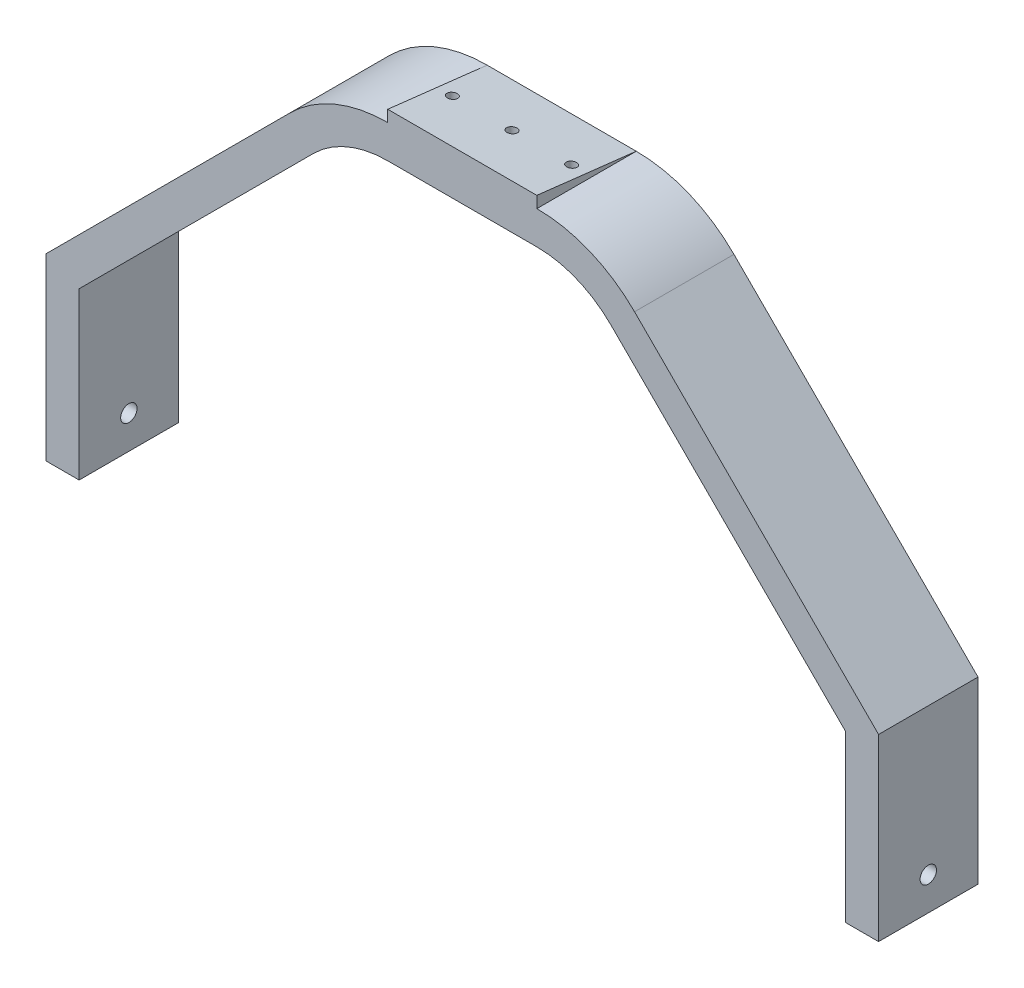
ISO-10303-21;
HEADER;
FILE_DESCRIPTION(('STEP AP214'),'2;1');
FILE_NAME('part.step','',(''),(''),'','','');
FILE_SCHEMA(('AUTOMOTIVE_DESIGN { 1 0 10303 214 1 1 1 1 }'));
ENDSEC;
DATA;
#1=APPLICATION_CONTEXT('core data for automotive mechanical design processes');
#2=APPLICATION_PROTOCOL_DEFINITION('international standard','automotive_design',2000,#1);
#3=PRODUCT_CONTEXT('',#1,'mechanical');
#4=PRODUCT('Part','Part','',(#3));
#5=PRODUCT_RELATED_PRODUCT_CATEGORY('part','',(#4));
#6=PRODUCT_DEFINITION_FORMATION('','',#4);
#7=PRODUCT_DEFINITION_CONTEXT('part definition',#1,'design');
#8=PRODUCT_DEFINITION('design','',#6,#7);
#9=PRODUCT_DEFINITION_SHAPE('','',#8);
#10=(LENGTH_UNIT() NAMED_UNIT(*) SI_UNIT(.MILLI.,.METRE.));
#11=(NAMED_UNIT(*) PLANE_ANGLE_UNIT() SI_UNIT($,.RADIAN.));
#12=(NAMED_UNIT(*) SI_UNIT($,.STERADIAN.) SOLID_ANGLE_UNIT());
#13=UNCERTAINTY_MEASURE_WITH_UNIT(LENGTH_MEASURE(1.E-05),#10,'distance_accuracy_value','');
#14=(GEOMETRIC_REPRESENTATION_CONTEXT(3) GLOBAL_UNCERTAINTY_ASSIGNED_CONTEXT((#13)) GLOBAL_UNIT_ASSIGNED_CONTEXT((#10,
#11,#12)) REPRESENTATION_CONTEXT('',''));
#15=CARTESIAN_POINT('',(0.,0.,0.));
#16=DIRECTION('',(0.,0.,1.));
#17=DIRECTION('',(1.,0.,0.));
#18=AXIS2_PLACEMENT_3D('',#15,#16,#17);
#19=CARTESIAN_POINT('',(22.5,-36.689440670309,30.));
#20=DIRECTION('',(0.,0.,-1.));
#21=DIRECTION('',(-1.,0.,0.));
#22=AXIS2_PLACEMENT_3D('',#19,#20,#21);
#23=CYLINDRICAL_SURFACE('',#22,41.689440670309);
#24=CARTESIAN_POINT('',(22.5,-36.689440670309,0.));
#25=DIRECTION('',(0.,0.,1.));
#26=DIRECTION('',(-1.,0.,0.));
#27=AXIS2_PLACEMENT_3D('',#24,#25,#26);
#28=CIRCLE('',#27,41.689440670309);
#29=CARTESIAN_POINT('',(51.9788862018499,-7.21055446845947,0.));
#30=VERTEX_POINT('',#29);
#31=CARTESIAN_POINT('',(22.5,5.,0.));
#32=VERTEX_POINT('',#31);
#33=EDGE_CURVE('E201',#30,#32,#28,.T.);
#34=ORIENTED_EDGE('',*,*,#33,.T.);
#35=DIRECTION('',(0.,0.,-1.));
#36=VECTOR('',#35,1.);
#37=CARTESIAN_POINT('',(22.5,5.,30.));
#38=LINE('',#37,#36);
#39=CARTESIAN_POINT('',(22.5,5.,30.));
#40=VERTEX_POINT('',#39);
#41=EDGE_CURVE('E11',#40,#32,#38,.T.);
#42=ORIENTED_EDGE('',*,*,#41,.F.);
#43=CARTESIAN_POINT('',(22.5,-36.689440670309,30.));
#44=DIRECTION('',(0.,0.,1.));
#45=DIRECTION('',(-1.,0.,0.));
#46=AXIS2_PLACEMENT_3D('',#43,#44,#45);
#47=CIRCLE('',#46,41.689440670309);
#48=CARTESIAN_POINT('',(51.9788862018499,-7.21055446845947,30.));
#49=VERTEX_POINT('',#48);
#50=EDGE_CURVE('E247',#49,#40,#47,.T.);
#51=ORIENTED_EDGE('',*,*,#50,.F.);
#52=DIRECTION('',(0.,0.,-1.));
#53=VECTOR('',#52,1.);
#54=CARTESIAN_POINT('',(51.9788862018499,-7.21055446845947,30.));
#55=LINE('',#54,#53);
#56=EDGE_CURVE('E197',#49,#30,#55,.T.);
#57=ORIENTED_EDGE('',*,*,#56,.T.);
#58=EDGE_LOOP('',(#34,#42,#51,#57));
#59=FACE_BOUND('',#58,.T.);
#60=ADVANCED_FACE('F45',(#59),#23,.T.);
#61=CARTESIAN_POINT('',(-22.5,-36.689440670309,30.));
#62=DIRECTION('',(0.,0.,-1.));
#63=DIRECTION('',(-1.,0.,0.));
#64=AXIS2_PLACEMENT_3D('',#61,#62,#63);
#65=CYLINDRICAL_SURFACE('',#64,41.689440670309);
#66=CARTESIAN_POINT('',(-22.5,-36.689440670309,0.));
#67=DIRECTION('',(0.,0.,1.));
#68=DIRECTION('',(1.,0.,0.));
#69=AXIS2_PLACEMENT_3D('',#66,#67,#68);
#70=CIRCLE('',#69,41.689440670309);
#71=CARTESIAN_POINT('',(-22.5,5.,0.));
#72=VERTEX_POINT('',#71);
#73=CARTESIAN_POINT('',(-51.9788862018499,-7.21055446845943,0.));
#74=VERTEX_POINT('',#73);
#75=EDGE_CURVE('E205',#72,#74,#70,.T.);
#76=ORIENTED_EDGE('',*,*,#75,.T.);
#77=DIRECTION('',(0.,0.,-1.));
#78=VECTOR('',#77,1.);
#79=CARTESIAN_POINT('',(-51.9788862018499,-7.21055446845943,30.));
#80=LINE('',#79,#78);
#81=CARTESIAN_POINT('',(-51.9788862018499,-7.21055446845943,30.));
#82=VERTEX_POINT('',#81);
#83=EDGE_CURVE('E290',#82,#74,#80,.T.);
#84=ORIENTED_EDGE('',*,*,#83,.F.);
#85=CARTESIAN_POINT('',(-22.5,-36.689440670309,30.));
#86=DIRECTION('',(0.,0.,1.));
#87=DIRECTION('',(1.,0.,0.));
#88=AXIS2_PLACEMENT_3D('',#85,#86,#87);
#89=CIRCLE('',#88,41.689440670309);
#90=CARTESIAN_POINT('',(-22.5,5.,30.));
#91=VERTEX_POINT('',#90);
#92=EDGE_CURVE('E359',#91,#82,#89,.T.);
#93=ORIENTED_EDGE('',*,*,#92,.F.);
#94=DIRECTION('',(0.,0.,-1.));
#95=VECTOR('',#94,1.);
#96=CARTESIAN_POINT('',(-22.5,5.,30.));
#97=LINE('',#96,#95);
#98=EDGE_CURVE('E54',#91,#72,#97,.T.);
#99=ORIENTED_EDGE('',*,*,#98,.T.);
#100=EDGE_LOOP('',(#76,#84,#93,#99));
#101=FACE_BOUND('',#100,.T.);
#102=ADVANCED_FACE('F414',(#101),#65,.T.);
#103=CARTESIAN_POINT('',(-122.689564320504,-77.9212325871146,30.));
#104=DIRECTION('',(0.707106781186551,-0.707106781186544,0.));
#105=DIRECTION('',(0.707106781186544,0.707106781186551,0.));
#106=AXIS2_PLACEMENT_3D('',#103,#104,#105);
#107=PLANE('',#106);
#108=DIRECTION('',(-0.707106781186544,-0.707106781186551,0.));
#109=VECTOR('',#108,1.);
#110=CARTESIAN_POINT('',(-122.689564320504,-77.9212325871146,0.));
#111=LINE('',#110,#109);
#112=CARTESIAN_POINT('',(-125.618496508639,-80.8501647752491,0.));
#113=VERTEX_POINT('',#112);
#114=EDGE_CURVE('E210',#74,#113,#111,.T.);
#115=ORIENTED_EDGE('',*,*,#114,.T.);
#116=DIRECTION('',(0.,0.,-1.));
#117=VECTOR('',#116,1.);
#118=CARTESIAN_POINT('',(-125.618496508639,-80.8501647752491,30.));
#119=LINE('',#118,#117);
#120=CARTESIAN_POINT('',(-125.618496508639,-80.8501647752491,30.));
#121=VERTEX_POINT('',#120);
#122=EDGE_CURVE('E286',#121,#113,#119,.T.);
#123=ORIENTED_EDGE('',*,*,#122,.F.);
#124=DIRECTION('',(-0.707106781186544,-0.707106781186551,0.));
#125=VECTOR('',#124,1.);
#126=CARTESIAN_POINT('',(-51.9788862018499,-7.21055446845943,30.));
#127=LINE('',#126,#125);
#128=EDGE_CURVE('E362',#82,#121,#127,.T.);
#129=ORIENTED_EDGE('',*,*,#128,.F.);
#130=ORIENTED_EDGE('',*,*,#83,.T.);
#131=EDGE_LOOP('',(#115,#123,#129,#130));
#132=FACE_BOUND('',#131,.T.);
#133=ADVANCED_FACE('F434',(#132),#107,.F.);
#134=CARTESIAN_POINT('',(-125.618496508639,-134.99230039898,30.));
#135=DIRECTION('',(1.,0.,0.));
#136=DIRECTION('',(0.,0.,-1.));
#137=AXIS2_PLACEMENT_3D('',#134,#135,#136);
#138=PLANE('',#137);
#139=CARTESIAN_POINT('',(-125.618496508639,-124.99230039898,15.));
#140=DIRECTION('',(-1.,0.,0.));
#141=DIRECTION('',(0.,0.,1.));
#142=AXIS2_PLACEMENT_3D('',#139,#140,#141);
#143=CIRCLE('',#142,2.475);
#144=CARTESIAN_POINT('',(-125.618496508639,-124.99230039898,17.475));
#145=VERTEX_POINT('',#144);
#146=EDGE_CURVE('E310',#145,#145,#143,.T.);
#147=ORIENTED_EDGE('',*,*,#146,.F.);
#148=EDGE_LOOP('',(#147));
#149=FACE_BOUND('',#148,.T.);
#150=DIRECTION('',(0.,-1.,0.));
#151=VECTOR('',#150,1.);
#152=CARTESIAN_POINT('',(-125.618496508639,-134.99230039898,0.));
#153=LINE('',#152,#151);
#154=CARTESIAN_POINT('',(-125.618496508639,-134.99230039898,0.));
#155=VERTEX_POINT('',#154);
#156=EDGE_CURVE('E213',#113,#155,#153,.T.);
#157=ORIENTED_EDGE('',*,*,#156,.T.);
#158=DIRECTION('',(0.,0.,-1.));
#159=VECTOR('',#158,1.);
#160=CARTESIAN_POINT('',(-125.618496508639,-134.99230039898,30.));
#161=LINE('',#160,#159);
#162=CARTESIAN_POINT('',(-125.618496508639,-134.99230039898,30.));
#163=VERTEX_POINT('',#162);
#164=EDGE_CURVE('E282',#163,#155,#161,.T.);
#165=ORIENTED_EDGE('',*,*,#164,.F.);
#166=DIRECTION('',(0.,-1.,0.));
#167=VECTOR('',#166,1.);
#168=CARTESIAN_POINT('',(-125.618496508639,-134.99230039898,30.));
#169=LINE('',#168,#167);
#170=EDGE_CURVE('E365',#121,#163,#169,.T.);
#171=ORIENTED_EDGE('',*,*,#170,.F.);
#172=ORIENTED_EDGE('',*,*,#122,.T.);
#173=EDGE_LOOP('',(#157,#165,#171,#172));
#174=FACE_BOUND('',#173,.T.);
#175=ADVANCED_FACE('F439',(#149,#174),#138,.F.);
#176=CARTESIAN_POINT('',(-115.618496508639,-134.99230039898,30.));
#177=DIRECTION('',(0.,1.,0.));
#178=DIRECTION('',(0.,0.,1.));
#179=AXIS2_PLACEMENT_3D('',#176,#177,#178);
#180=PLANE('',#179);
#181=DIRECTION('',(1.,0.,0.));
#182=VECTOR('',#181,1.);
#183=CARTESIAN_POINT('',(-115.618496508639,-134.99230039898,0.));
#184=LINE('',#183,#182);
#185=CARTESIAN_POINT('',(-115.618496508639,-134.99230039898,0.));
#186=VERTEX_POINT('',#185);
#187=EDGE_CURVE('E216',#155,#186,#184,.T.);
#188=ORIENTED_EDGE('',*,*,#187,.T.);
#189=DIRECTION('',(0.,0.,-1.));
#190=VECTOR('',#189,1.);
#191=CARTESIAN_POINT('',(-115.618496508639,-134.99230039898,30.));
#192=LINE('',#191,#190);
#193=CARTESIAN_POINT('',(-115.618496508639,-134.99230039898,30.));
#194=VERTEX_POINT('',#193);
#195=EDGE_CURVE('E278',#194,#186,#192,.T.);
#196=ORIENTED_EDGE('',*,*,#195,.F.);
#197=DIRECTION('',(1.,0.,0.));
#198=VECTOR('',#197,1.);
#199=CARTESIAN_POINT('',(-115.618496508639,-134.99230039898,30.));
#200=LINE('',#199,#198);
#201=EDGE_CURVE('E368',#163,#194,#200,.T.);
#202=ORIENTED_EDGE('',*,*,#201,.F.);
#203=ORIENTED_EDGE('',*,*,#164,.T.);
#204=EDGE_LOOP('',(#188,#196,#202,#203));
#205=FACE_BOUND('',#204,.T.);
#206=ADVANCED_FACE('F445',(#205),#180,.F.);
#207=CARTESIAN_POINT('',(-115.618496508639,-84.99230039898,30.));
#208=DIRECTION('',(-1.,0.,0.));
#209=DIRECTION('',(0.,0.,1.));
#210=AXIS2_PLACEMENT_3D('',#207,#208,#209);
#211=PLANE('',#210);
#212=CARTESIAN_POINT('',(-115.618496508639,-124.99230039898,15.));
#213=DIRECTION('',(-1.,0.,0.));
#214=DIRECTION('',(0.,0.,1.));
#215=AXIS2_PLACEMENT_3D('',#212,#213,#214);
#216=CIRCLE('',#215,2.475);
#217=CARTESIAN_POINT('',(-115.618496508639,-124.99230039898,17.475));
#218=VERTEX_POINT('',#217);
#219=EDGE_CURVE('E206',#218,#218,#216,.T.);
#220=ORIENTED_EDGE('',*,*,#219,.T.);
#221=EDGE_LOOP('',(#220));
#222=FACE_BOUND('',#221,.T.);
#223=DIRECTION('',(0.,1.,0.));
#224=VECTOR('',#223,1.);
#225=CARTESIAN_POINT('',(-115.618496508639,-84.99230039898,0.));
#226=LINE('',#225,#224);
#227=CARTESIAN_POINT('',(-115.618496508639,-84.99230039898,0.));
#228=VERTEX_POINT('',#227);
#229=EDGE_CURVE('E219',#186,#228,#226,.T.);
#230=ORIENTED_EDGE('',*,*,#229,.T.);
#231=DIRECTION('',(0.,0.,-1.));
#232=VECTOR('',#231,1.);
#233=CARTESIAN_POINT('',(-115.618496508639,-84.99230039898,30.));
#234=LINE('',#233,#232);
#235=CARTESIAN_POINT('',(-115.618496508639,-84.99230039898,30.));
#236=VERTEX_POINT('',#235);
#237=EDGE_CURVE('E274',#236,#228,#234,.T.);
#238=ORIENTED_EDGE('',*,*,#237,.F.);
#239=DIRECTION('',(0.,1.,0.));
#240=VECTOR('',#239,1.);
#241=CARTESIAN_POINT('',(-115.618496508639,-84.99230039898,30.));
#242=LINE('',#241,#240);
#243=EDGE_CURVE('E371',#194,#236,#242,.T.);
#244=ORIENTED_EDGE('',*,*,#243,.F.);
#245=ORIENTED_EDGE('',*,*,#195,.T.);
#246=EDGE_LOOP('',(#230,#238,#244,#245));
#247=FACE_BOUND('',#246,.T.);
#248=ADVANCED_FACE('F449',(#222,#247),#211,.F.);
#249=CARTESIAN_POINT('',(-44.9078183899844,-14.2816222803249,30.));
#250=DIRECTION('',(-0.707106781186551,0.707106781186544,0.));
#251=DIRECTION('',(-0.707106781186544,-0.707106781186551,0.));
#252=AXIS2_PLACEMENT_3D('',#249,#250,#251);
#253=PLANE('',#252);
#254=DIRECTION('',(0.707106781186544,0.707106781186551,0.));
#255=VECTOR('',#254,1.);
#256=CARTESIAN_POINT('',(-44.9078183899844,-14.2816222803249,0.));
#257=LINE('',#256,#255);
#258=CARTESIAN_POINT('',(-44.9078183899844,-14.2816222803249,0.));
#259=VERTEX_POINT('',#258);
#260=EDGE_CURVE('E222',#228,#259,#257,.T.);
#261=ORIENTED_EDGE('',*,*,#260,.T.);
#262=DIRECTION('',(0.,0.,-1.));
#263=VECTOR('',#262,1.);
#264=CARTESIAN_POINT('',(-44.9078183899844,-14.2816222803249,30.));
#265=LINE('',#264,#263);
#266=CARTESIAN_POINT('',(-44.9078183899844,-14.2816222803249,30.));
#267=VERTEX_POINT('',#266);
#268=EDGE_CURVE('E270',#267,#259,#265,.T.);
#269=ORIENTED_EDGE('',*,*,#268,.F.);
#270=DIRECTION('',(0.707106781186544,0.707106781186551,0.));
#271=VECTOR('',#270,1.);
#272=CARTESIAN_POINT('',(-44.9078183899844,-14.2816222803249,30.));
#273=LINE('',#272,#271);
#274=EDGE_CURVE('E374',#236,#267,#273,.T.);
#275=ORIENTED_EDGE('',*,*,#274,.F.);
#276=ORIENTED_EDGE('',*,*,#237,.T.);
#277=EDGE_LOOP('',(#261,#269,#275,#276));
#278=FACE_BOUND('',#277,.T.);
#279=ADVANCED_FACE('F453',(#278),#253,.F.);
#280=CARTESIAN_POINT('',(-22.5,-36.689440670309,30.));
#281=DIRECTION('',(0.,0.,-1.));
#282=DIRECTION('',(-1.,0.,0.));
#283=AXIS2_PLACEMENT_3D('',#280,#281,#282);
#284=CYLINDRICAL_SURFACE('',#283,31.689440670309);
#285=CARTESIAN_POINT('',(-22.5,-36.689440670309,0.));
#286=DIRECTION('',(0.,0.,-1.));
#287=DIRECTION('',(1.,0.,0.));
#288=AXIS2_PLACEMENT_3D('',#285,#286,#287);
#289=CIRCLE('',#288,31.689440670309);
#290=CARTESIAN_POINT('',(-22.5,-5.,0.));
#291=VERTEX_POINT('',#290);
#292=EDGE_CURVE('E225',#259,#291,#289,.T.);
#293=ORIENTED_EDGE('',*,*,#292,.T.);
#294=DIRECTION('',(0.,0.,-1.));
#295=VECTOR('',#294,1.);
#296=CARTESIAN_POINT('',(-22.5,-5.,30.));
#297=LINE('',#296,#295);
#298=CARTESIAN_POINT('',(-22.5,-5.,30.));
#299=VERTEX_POINT('',#298);
#300=EDGE_CURVE('E266',#299,#291,#297,.T.);
#301=ORIENTED_EDGE('',*,*,#300,.F.);
#302=CARTESIAN_POINT('',(-22.5,-36.689440670309,30.));
#303=DIRECTION('',(0.,0.,-1.));
#304=DIRECTION('',(1.,0.,0.));
#305=AXIS2_PLACEMENT_3D('',#302,#303,#304);
#306=CIRCLE('',#305,31.689440670309);
#307=EDGE_CURVE('E377',#267,#299,#306,.T.);
#308=ORIENTED_EDGE('',*,*,#307,.F.);
#309=ORIENTED_EDGE('',*,*,#268,.T.);
#310=EDGE_LOOP('',(#293,#301,#308,#309));
#311=FACE_BOUND('',#310,.T.);
#312=ADVANCED_FACE('F457',(#311),#284,.F.);
#313=CARTESIAN_POINT('',(-22.5,-5.,30.));
#314=DIRECTION('',(0.,1.,0.));
#315=DIRECTION('',(0.,0.,1.));
#316=AXIS2_PLACEMENT_3D('',#313,#314,#315);
#317=PLANE('',#316);
#318=CARTESIAN_POINT('',(18.,-5.,15.));
#319=DIRECTION('',(0.,1.,0.));
#320=DIRECTION('',(0.,0.,1.));
#321=AXIS2_PLACEMENT_3D('',#318,#319,#320);
#322=CIRCLE('',#321,1.5);
#323=CARTESIAN_POINT('',(18.,-5.,16.5));
#324=VERTEX_POINT('',#323);
#325=EDGE_CURVE('E306',#324,#324,#322,.T.);
#326=ORIENTED_EDGE('',*,*,#325,.T.);
#327=EDGE_LOOP('',(#326));
#328=FACE_BOUND('',#327,.T.);
#329=CARTESIAN_POINT('',(-18.,-5.,15.));
#330=DIRECTION('',(0.,1.,0.));
#331=DIRECTION('',(0.,0.,1.));
#332=AXIS2_PLACEMENT_3D('',#329,#330,#331);
#333=CIRCLE('',#332,1.5);
#334=CARTESIAN_POINT('',(-18.,-5.,16.5));
#335=VERTEX_POINT('',#334);
#336=EDGE_CURVE('E301',#335,#335,#333,.T.);
#337=ORIENTED_EDGE('',*,*,#336,.T.);
#338=EDGE_LOOP('',(#337));
#339=FACE_BOUND('',#338,.T.);
#340=CARTESIAN_POINT('',(0.,-5.,15.));
#341=DIRECTION('',(0.,1.,0.));
#342=DIRECTION('',(0.,0.,1.));
#343=AXIS2_PLACEMENT_3D('',#340,#341,#342);
#344=CIRCLE('',#343,1.5);
#345=CARTESIAN_POINT('',(0.,-5.,16.5));
#346=VERTEX_POINT('',#345);
#347=EDGE_CURVE('E297',#346,#346,#344,.T.);
#348=ORIENTED_EDGE('',*,*,#347,.T.);
#349=EDGE_LOOP('',(#348));
#350=FACE_BOUND('',#349,.T.);
#351=DIRECTION('',(1.,0.,0.));
#352=VECTOR('',#351,1.);
#353=CARTESIAN_POINT('',(-22.5,-5.,0.));
#354=LINE('',#353,#352);
#355=CARTESIAN_POINT('',(22.5,-5.,0.));
#356=VERTEX_POINT('',#355);
#357=EDGE_CURVE('E228',#291,#356,#354,.T.);
#358=ORIENTED_EDGE('',*,*,#357,.T.);
#359=DIRECTION('',(0.,0.,-1.));
#360=VECTOR('',#359,1.);
#361=CARTESIAN_POINT('',(22.5,-5.,30.));
#362=LINE('',#361,#360);
#363=CARTESIAN_POINT('',(22.5,-5.,30.));
#364=VERTEX_POINT('',#363);
#365=EDGE_CURVE('E262',#364,#356,#362,.T.);
#366=ORIENTED_EDGE('',*,*,#365,.F.);
#367=DIRECTION('',(1.,0.,0.));
#368=VECTOR('',#367,1.);
#369=CARTESIAN_POINT('',(-22.5,-5.,30.));
#370=LINE('',#369,#368);
#371=EDGE_CURVE('E380',#299,#364,#370,.T.);
#372=ORIENTED_EDGE('',*,*,#371,.F.);
#373=ORIENTED_EDGE('',*,*,#300,.T.);
#374=EDGE_LOOP('',(#358,#366,#372,#373));
#375=FACE_BOUND('',#374,.T.);
#376=ADVANCED_FACE('F461',(#328,#339,#350,#375),#317,.F.);
#377=CARTESIAN_POINT('',(22.5,-36.689440670309,30.));
#378=DIRECTION('',(0.,0.,-1.));
#379=DIRECTION('',(-1.,0.,0.));
#380=AXIS2_PLACEMENT_3D('',#377,#378,#379);
#381=CYLINDRICAL_SURFACE('',#380,31.689440670309);
#382=CARTESIAN_POINT('',(22.5,-36.689440670309,0.));
#383=DIRECTION('',(0.,0.,-1.));
#384=DIRECTION('',(-1.,0.,0.));
#385=AXIS2_PLACEMENT_3D('',#382,#383,#384);
#386=CIRCLE('',#385,31.689440670309);
#387=CARTESIAN_POINT('',(44.9078183899844,-14.2816222803249,0.));
#388=VERTEX_POINT('',#387);
#389=EDGE_CURVE('E231',#356,#388,#386,.T.);
#390=ORIENTED_EDGE('',*,*,#389,.T.);
#391=DIRECTION('',(0.,0.,-1.));
#392=VECTOR('',#391,1.);
#393=CARTESIAN_POINT('',(44.9078183899844,-14.2816222803249,30.));
#394=LINE('',#393,#392);
#395=CARTESIAN_POINT('',(44.9078183899844,-14.2816222803249,30.));
#396=VERTEX_POINT('',#395);
#397=EDGE_CURVE('E258',#396,#388,#394,.T.);
#398=ORIENTED_EDGE('',*,*,#397,.F.);
#399=CARTESIAN_POINT('',(22.5,-36.689440670309,30.));
#400=DIRECTION('',(0.,0.,-1.));
#401=DIRECTION('',(-1.,0.,0.));
#402=AXIS2_PLACEMENT_3D('',#399,#400,#401);
#403=CIRCLE('',#402,31.689440670309);
#404=EDGE_CURVE('E383',#364,#396,#403,.T.);
#405=ORIENTED_EDGE('',*,*,#404,.F.);
#406=ORIENTED_EDGE('',*,*,#365,.T.);
#407=EDGE_LOOP('',(#390,#398,#405,#406));
#408=FACE_BOUND('',#407,.T.);
#409=ADVANCED_FACE('F464',(#408),#381,.F.);
#410=CARTESIAN_POINT('',(44.9078183899844,-14.2816222803249,30.));
#411=DIRECTION('',(0.707106781186552,0.707106781186543,0.));
#412=DIRECTION('',(-0.707106781186543,0.707106781186552,0.));
#413=AXIS2_PLACEMENT_3D('',#410,#411,#412);
#414=PLANE('',#413);
#415=DIRECTION('',(0.707106781186543,-0.707106781186552,0.));
#416=VECTOR('',#415,1.);
#417=CARTESIAN_POINT('',(44.9078183899844,-14.2816222803249,0.));
#418=LINE('',#417,#416);
#419=CARTESIAN_POINT('',(115.618496508639,-84.9923003989801,0.));
#420=VERTEX_POINT('',#419);
#421=EDGE_CURVE('E234',#388,#420,#418,.T.);
#422=ORIENTED_EDGE('',*,*,#421,.T.);
#423=DIRECTION('',(0.,0.,-1.));
#424=VECTOR('',#423,1.);
#425=CARTESIAN_POINT('',(115.618496508639,-84.9923003989801,30.));
#426=LINE('',#425,#424);
#427=CARTESIAN_POINT('',(115.618496508639,-84.9923003989801,30.));
#428=VERTEX_POINT('',#427);
#429=EDGE_CURVE('E254',#428,#420,#426,.T.);
#430=ORIENTED_EDGE('',*,*,#429,.F.);
#431=DIRECTION('',(0.707106781186543,-0.707106781186552,0.));
#432=VECTOR('',#431,1.);
#433=CARTESIAN_POINT('',(44.9078183899844,-14.2816222803249,30.));
#434=LINE('',#433,#432);
#435=EDGE_CURVE('E386',#396,#428,#434,.T.);
#436=ORIENTED_EDGE('',*,*,#435,.F.);
#437=ORIENTED_EDGE('',*,*,#397,.T.);
#438=EDGE_LOOP('',(#422,#430,#436,#437));
#439=FACE_BOUND('',#438,.T.);
#440=ADVANCED_FACE('F394',(#439),#414,.F.);
#441=CARTESIAN_POINT('',(115.618496508639,-84.9923003989801,30.));
#442=DIRECTION('',(1.,0.,0.));
#443=DIRECTION('',(0.,1.,0.));
#444=AXIS2_PLACEMENT_3D('',#441,#442,#443);
#445=PLANE('',#444);
#446=CARTESIAN_POINT('',(115.618496508639,-124.99230039898,15.));
#447=DIRECTION('',(1.,0.,0.));
#448=DIRECTION('',(0.,1.,0.));
#449=AXIS2_PLACEMENT_3D('',#446,#447,#448);
#450=CIRCLE('',#449,2.475);
#451=CARTESIAN_POINT('',(115.618496508639,-122.51730039898,15.));
#452=VERTEX_POINT('',#451);
#453=EDGE_CURVE('E347',#452,#452,#450,.T.);
#454=ORIENTED_EDGE('',*,*,#453,.T.);
#455=EDGE_LOOP('',(#454));
#456=FACE_BOUND('',#455,.T.);
#457=DIRECTION('',(0.,-1.,0.));
#458=VECTOR('',#457,1.);
#459=CARTESIAN_POINT('',(115.618496508639,-84.9923003989801,0.));
#460=LINE('',#459,#458);
#461=CARTESIAN_POINT('',(115.618496508639,-134.99230039898,0.));
#462=VERTEX_POINT('',#461);
#463=EDGE_CURVE('E237',#420,#462,#460,.T.);
#464=ORIENTED_EDGE('',*,*,#463,.T.);
#465=DIRECTION('',(0.,0.,-1.));
#466=VECTOR('',#465,1.);
#467=CARTESIAN_POINT('',(115.618496508639,-134.99230039898,30.));
#468=LINE('',#467,#466);
#469=CARTESIAN_POINT('',(115.618496508639,-134.99230039898,30.));
#470=VERTEX_POINT('',#469);
#471=EDGE_CURVE('E190',#470,#462,#468,.T.);
#472=ORIENTED_EDGE('',*,*,#471,.F.);
#473=DIRECTION('',(0.,-1.,0.));
#474=VECTOR('',#473,1.);
#475=CARTESIAN_POINT('',(115.618496508639,-84.9923003989801,30.));
#476=LINE('',#475,#474);
#477=EDGE_CURVE('E175',#428,#470,#476,.T.);
#478=ORIENTED_EDGE('',*,*,#477,.F.);
#479=ORIENTED_EDGE('',*,*,#429,.T.);
#480=EDGE_LOOP('',(#464,#472,#478,#479));
#481=FACE_BOUND('',#480,.T.);
#482=ADVANCED_FACE('F398',(#456,#481),#445,.F.);
#483=CARTESIAN_POINT('',(115.618496508639,-134.99230039898,30.));
#484=DIRECTION('',(0.,1.,0.));
#485=DIRECTION('',(0.,0.,1.));
#486=AXIS2_PLACEMENT_3D('',#483,#484,#485);
#487=PLANE('',#486);
#488=DIRECTION('',(1.,0.,0.));
#489=VECTOR('',#488,1.);
#490=CARTESIAN_POINT('',(115.618496508639,-134.99230039898,0.));
#491=LINE('',#490,#489);
#492=CARTESIAN_POINT('',(125.618496508639,-134.99230039898,0.));
#493=VERTEX_POINT('',#492);
#494=EDGE_CURVE('E185',#462,#493,#491,.T.);
#495=ORIENTED_EDGE('',*,*,#494,.T.);
#496=DIRECTION('',(0.,0.,-1.));
#497=VECTOR('',#496,1.);
#498=CARTESIAN_POINT('',(125.618496508639,-134.99230039898,30.));
#499=LINE('',#498,#497);
#500=CARTESIAN_POINT('',(125.618496508639,-134.99230039898,30.));
#501=VERTEX_POINT('',#500);
#502=EDGE_CURVE('E182',#501,#493,#499,.T.);
#503=ORIENTED_EDGE('',*,*,#502,.F.);
#504=DIRECTION('',(1.,0.,0.));
#505=VECTOR('',#504,1.);
#506=CARTESIAN_POINT('',(115.618496508639,-134.99230039898,30.));
#507=LINE('',#506,#505);
#508=EDGE_CURVE('E168',#470,#501,#507,.T.);
#509=ORIENTED_EDGE('',*,*,#508,.F.);
#510=ORIENTED_EDGE('',*,*,#471,.T.);
#511=EDGE_LOOP('',(#495,#503,#509,#510));
#512=FACE_BOUND('',#511,.T.);
#513=ADVANCED_FACE('F183',(#512),#487,.F.);
#514=CARTESIAN_POINT('',(125.618496508639,-134.99230039898,30.));
#515=DIRECTION('',(-1.,0.,0.));
#516=DIRECTION('',(0.,-1.,0.));
#517=AXIS2_PLACEMENT_3D('',#514,#515,#516);
#518=PLANE('',#517);
#519=CARTESIAN_POINT('',(125.618496508639,-124.99230039898,15.));
#520=DIRECTION('',(-1.,0.,0.));
#521=DIRECTION('',(0.,0.,1.));
#522=AXIS2_PLACEMENT_3D('',#519,#520,#521);
#523=CIRCLE('',#522,2.475);
#524=CARTESIAN_POINT('',(125.618496508639,-124.99230039898,17.475));
#525=VERTEX_POINT('',#524);
#526=EDGE_CURVE('E343',#525,#525,#523,.T.);
#527=ORIENTED_EDGE('',*,*,#526,.T.);
#528=EDGE_LOOP('',(#527));
#529=FACE_BOUND('',#528,.T.);
#530=DIRECTION('',(0.,1.,0.));
#531=VECTOR('',#530,1.);
#532=CARTESIAN_POINT('',(125.618496508639,-134.99230039898,0.));
#533=LINE('',#532,#531);
#534=CARTESIAN_POINT('',(125.618496508639,-80.8501647752492,0.));
#535=VERTEX_POINT('',#534);
#536=EDGE_CURVE('E242',#493,#535,#533,.T.);
#537=ORIENTED_EDGE('',*,*,#536,.T.);
#538=DIRECTION('',(0.,0.,-1.));
#539=VECTOR('',#538,1.);
#540=CARTESIAN_POINT('',(125.618496508639,-80.8501647752492,30.));
#541=LINE('',#540,#539);
#542=CARTESIAN_POINT('',(125.618496508639,-80.8501647752492,30.));
#543=VERTEX_POINT('',#542);
#544=EDGE_CURVE('E191',#543,#535,#541,.T.);
#545=ORIENTED_EDGE('',*,*,#544,.F.);
#546=DIRECTION('',(0.,1.,0.));
#547=VECTOR('',#546,1.);
#548=CARTESIAN_POINT('',(125.618496508639,-134.99230039898,30.));
#549=LINE('',#548,#547);
#550=EDGE_CURVE('E172',#501,#543,#549,.T.);
#551=ORIENTED_EDGE('',*,*,#550,.F.);
#552=ORIENTED_EDGE('',*,*,#502,.T.);
#553=EDGE_LOOP('',(#537,#545,#551,#552));
#554=FACE_BOUND('',#553,.T.);
#555=ADVANCED_FACE('F193',(#529,#554),#518,.F.);
#556=CARTESIAN_POINT('',(51.9788862018499,-7.21055446845947,30.));
#557=DIRECTION('',(-0.707106781186552,-0.707106781186543,0.));
#558=DIRECTION('',(0.707106781186543,-0.707106781186552,0.));
#559=AXIS2_PLACEMENT_3D('',#556,#557,#558);
#560=PLANE('',#559);
#561=DIRECTION('',(-0.707106781186543,0.707106781186552,0.));
#562=VECTOR('',#561,1.);
#563=CARTESIAN_POINT('',(51.9788862018499,-7.21055446845947,0.));
#564=LINE('',#563,#562);
#565=EDGE_CURVE('E121',#535,#30,#564,.T.);
#566=ORIENTED_EDGE('',*,*,#565,.T.);
#567=ORIENTED_EDGE('',*,*,#56,.F.);
#568=DIRECTION('',(-0.707106781186544,0.707106781186551,0.));
#569=VECTOR('',#568,1.);
#570=CARTESIAN_POINT('',(122.689564320504,-77.9212325871147,30.));
#571=LINE('',#570,#569);
#572=EDGE_CURVE('E71',#543,#49,#571,.T.);
#573=ORIENTED_EDGE('',*,*,#572,.F.);
#574=ORIENTED_EDGE('',*,*,#544,.T.);
#575=EDGE_LOOP('',(#566,#567,#573,#574));
#576=FACE_BOUND('',#575,.T.);
#577=ADVANCED_FACE('F402',(#576),#560,.F.);
#578=CARTESIAN_POINT('',(22.5,-36.689440670309,30.));
#579=DIRECTION('',(0.,0.,-1.));
#580=DIRECTION('',(-1.,0.,0.));
#581=AXIS2_PLACEMENT_3D('',#578,#579,#580);
#582=PLANE('',#581);
#583=DIRECTION('',(0.,-1.,0.));
#584=VECTOR('',#583,1.);
#585=CARTESIAN_POINT('',(22.5,17.,30.));
#586=LINE('',#585,#584);
#587=CARTESIAN_POINT('',(22.5,8.47111843025185,30.));
#588=VERTEX_POINT('',#587);
#589=EDGE_CURVE('E128',#588,#40,#586,.T.);
#590=ORIENTED_EDGE('',*,*,#589,.F.);
#591=DIRECTION('',(1.,0.,0.));
#592=VECTOR('',#591,1.);
#593=CARTESIAN_POINT('',(-125.618496508639,8.47111843025185,30.));
#594=LINE('',#593,#592);
#595=CARTESIAN_POINT('',(-22.5,8.47111843025185,30.));
#596=VERTEX_POINT('',#595);
#597=EDGE_CURVE('E62',#596,#588,#594,.T.);
#598=ORIENTED_EDGE('',*,*,#597,.F.);
#599=DIRECTION('',(0.,-1.,0.));
#600=VECTOR('',#599,1.);
#601=CARTESIAN_POINT('',(-22.5,17.,30.));
#602=LINE('',#601,#600);
#603=EDGE_CURVE('E302',#596,#91,#602,.T.);
#604=ORIENTED_EDGE('',*,*,#603,.T.);
#605=ORIENTED_EDGE('',*,*,#92,.T.);
#606=ORIENTED_EDGE('',*,*,#128,.T.);
#607=ORIENTED_EDGE('',*,*,#170,.T.);
#608=ORIENTED_EDGE('',*,*,#201,.T.);
#609=ORIENTED_EDGE('',*,*,#243,.T.);
#610=ORIENTED_EDGE('',*,*,#274,.T.);
#611=ORIENTED_EDGE('',*,*,#307,.T.);
#612=ORIENTED_EDGE('',*,*,#371,.T.);
#613=ORIENTED_EDGE('',*,*,#404,.T.);
#614=ORIENTED_EDGE('',*,*,#435,.T.);
#615=ORIENTED_EDGE('',*,*,#477,.T.);
#616=ORIENTED_EDGE('',*,*,#508,.T.);
#617=ORIENTED_EDGE('',*,*,#550,.T.);
#618=ORIENTED_EDGE('',*,*,#572,.T.);
#619=ORIENTED_EDGE('',*,*,#50,.T.);
#620=EDGE_LOOP('',(#590,#598,#604,#605,#606,#607,#608,#609,#610,#611,#612,#613,#614,#615,#616,
#617,#618,#619));
#621=FACE_BOUND('',#620,.T.);
#622=ADVANCED_FACE('F170',(#621),#582,.F.);
#623=CARTESIAN_POINT('',(22.5,-36.689440670309,0.));
#624=DIRECTION('',(0.,0.,-1.));
#625=DIRECTION('',(-1.,0.,0.));
#626=AXIS2_PLACEMENT_3D('',#623,#624,#625);
#627=PLANE('',#626);
#628=DIRECTION('',(1.,0.,0.));
#629=VECTOR('',#628,1.);
#630=CARTESIAN_POINT('',(-125.618496508639,5.,0.));
#631=LINE('',#630,#629);
#632=EDGE_CURVE('E330',#72,#32,#631,.T.);
#633=ORIENTED_EDGE('',*,*,#632,.T.);
#634=ORIENTED_EDGE('',*,*,#33,.F.);
#635=ORIENTED_EDGE('',*,*,#565,.F.);
#636=ORIENTED_EDGE('',*,*,#536,.F.);
#637=ORIENTED_EDGE('',*,*,#494,.F.);
#638=ORIENTED_EDGE('',*,*,#463,.F.);
#639=ORIENTED_EDGE('',*,*,#421,.F.);
#640=ORIENTED_EDGE('',*,*,#389,.F.);
#641=ORIENTED_EDGE('',*,*,#357,.F.);
#642=ORIENTED_EDGE('',*,*,#292,.F.);
#643=ORIENTED_EDGE('',*,*,#260,.F.);
#644=ORIENTED_EDGE('',*,*,#229,.F.);
#645=ORIENTED_EDGE('',*,*,#187,.F.);
#646=ORIENTED_EDGE('',*,*,#156,.F.);
#647=ORIENTED_EDGE('',*,*,#114,.F.);
#648=ORIENTED_EDGE('',*,*,#75,.F.);
#649=EDGE_LOOP('',(#633,#634,#635,#636,#637,#638,#639,#640,#641,#642,#643,#644,#645,#646,#647,#648));
#650=FACE_BOUND('',#649,.T.);
#651=ADVANCED_FACE('F400',(#650),#627,.T.);
#652=CARTESIAN_POINT('',(125.618496508639,-124.99230039898,15.));
#653=DIRECTION('',(-1.,0.,0.));
#654=DIRECTION('',(0.,0.,1.));
#655=AXIS2_PLACEMENT_3D('',#652,#653,#654);
#656=CYLINDRICAL_SURFACE('',#655,2.475);
#657=ORIENTED_EDGE('',*,*,#526,.F.);
#658=EDGE_LOOP('',(#657));
#659=FACE_BOUND('',#658,.T.);
#660=ORIENTED_EDGE('',*,*,#453,.F.);
#661=EDGE_LOOP('',(#660));
#662=FACE_BOUND('',#661,.T.);
#663=ADVANCED_FACE('F483',(#659,#662),#656,.F.);
#664=ORIENTED_EDGE('',*,*,#146,.T.);
#665=EDGE_LOOP('',(#664));
#666=FACE_BOUND('',#665,.T.);
#667=ORIENTED_EDGE('',*,*,#219,.F.);
#668=EDGE_LOOP('',(#667));
#669=FACE_BOUND('',#668,.T.);
#670=ADVANCED_FACE('F485',(#666,#669),#656,.F.);
#671=CARTESIAN_POINT('',(0.,-134.99230039898,15.));
#672=DIRECTION('',(0.,1.,0.));
#673=DIRECTION('',(0.,0.,1.));
#674=AXIS2_PLACEMENT_3D('',#671,#672,#673);
#675=CYLINDRICAL_SURFACE('',#674,1.5);
#676=ORIENTED_EDGE('',*,*,#347,.F.);
#677=EDGE_LOOP('',(#676));
#678=FACE_BOUND('',#677,.T.);
#679=CARTESIAN_POINT('',(0.,6.73555921512593,15.));
#680=DIRECTION('',(0.,-0.993372765600397,0.11493715049286));
#681=DIRECTION('',(0.,-0.11493715049286,-0.993372765600397));
#682=AXIS2_PLACEMENT_3D('',#679,#680,#681);
#683=ELLIPSE('',#682,1.51000717147042,1.5);
#684=CARTESIAN_POINT('',(0.,6.56200329361333,13.5));
#685=VERTEX_POINT('',#684);
#686=EDGE_CURVE('E311',#685,#685,#683,.T.);
#687=ORIENTED_EDGE('',*,*,#686,.F.);
#688=EDGE_LOOP('',(#687));
#689=FACE_BOUND('',#688,.T.);
#690=ADVANCED_FACE('F488',(#678,#689),#675,.F.);
#691=CARTESIAN_POINT('',(-18.,-134.99230039898,15.));
#692=DIRECTION('',(0.,1.,0.));
#693=DIRECTION('',(0.,0.,1.));
#694=AXIS2_PLACEMENT_3D('',#691,#692,#693);
#695=CYLINDRICAL_SURFACE('',#694,1.5);
#696=ORIENTED_EDGE('',*,*,#336,.F.);
#697=EDGE_LOOP('',(#696));
#698=FACE_BOUND('',#697,.T.);
#699=CARTESIAN_POINT('',(-18.,6.73555921512593,15.));
#700=DIRECTION('',(0.,-0.993372765600397,0.11493715049286));
#701=DIRECTION('',(0.,-0.11493715049286,-0.993372765600397));
#702=AXIS2_PLACEMENT_3D('',#699,#700,#701);
#703=ELLIPSE('',#702,1.51000717147042,1.5);
#704=CARTESIAN_POINT('',(-18.,6.56200329361334,13.5));
#705=VERTEX_POINT('',#704);
#706=EDGE_CURVE('E314',#705,#705,#703,.T.);
#707=ORIENTED_EDGE('',*,*,#706,.F.);
#708=EDGE_LOOP('',(#707));
#709=FACE_BOUND('',#708,.T.);
#710=ADVANCED_FACE('F491',(#698,#709),#695,.F.);
#711=CARTESIAN_POINT('',(18.,-134.99230039898,15.));
#712=DIRECTION('',(0.,1.,0.));
#713=DIRECTION('',(0.,0.,1.));
#714=AXIS2_PLACEMENT_3D('',#711,#712,#713);
#715=CYLINDRICAL_SURFACE('',#714,1.5);
#716=ORIENTED_EDGE('',*,*,#325,.F.);
#717=EDGE_LOOP('',(#716));
#718=FACE_BOUND('',#717,.T.);
#719=CARTESIAN_POINT('',(18.,6.73555921512593,15.));
#720=DIRECTION('',(0.,-0.993372765600397,0.11493715049286));
#721=DIRECTION('',(0.,-0.11493715049286,-0.993372765600397));
#722=AXIS2_PLACEMENT_3D('',#719,#720,#721);
#723=ELLIPSE('',#722,1.51000717147042,1.5);
#724=CARTESIAN_POINT('',(18.,6.56200329361334,13.5));
#725=VERTEX_POINT('',#724);
#726=EDGE_CURVE('E48',#725,#725,#723,.T.);
#727=ORIENTED_EDGE('',*,*,#726,.F.);
#728=EDGE_LOOP('',(#727));
#729=FACE_BOUND('',#728,.T.);
#730=ADVANCED_FACE('F427',(#718,#729),#715,.F.);
#731=CARTESIAN_POINT('',(-22.5,17.,0.));
#732=DIRECTION('',(1.,0.,0.));
#733=DIRECTION('',(0.,0.,-1.));
#734=AXIS2_PLACEMENT_3D('',#731,#732,#733);
#735=PLANE('',#734);
#736=ORIENTED_EDGE('',*,*,#603,.F.);
#737=DIRECTION('',(0.,-0.11493715049286,-0.993372765600397));
#738=VECTOR('',#737,1.);
#739=CARTESIAN_POINT('',(-22.5,5.15852658276102,1.37010522066386));
#740=LINE('',#739,#738);
#741=EDGE_CURVE('E334',#596,#72,#740,.T.);
#742=ORIENTED_EDGE('',*,*,#741,.T.);
#743=ORIENTED_EDGE('',*,*,#98,.F.);
#744=EDGE_LOOP('',(#736,#742,#743));
#745=FACE_BOUND('',#744,.T.);
#746=ADVANCED_FACE('F411',(#745),#735,.F.);
#747=CARTESIAN_POINT('',(22.5,17.,0.));
#748=DIRECTION('',(-1.,0.,0.));
#749=DIRECTION('',(0.,0.,1.));
#750=AXIS2_PLACEMENT_3D('',#747,#748,#749);
#751=PLANE('',#750);
#752=ORIENTED_EDGE('',*,*,#41,.T.);
#753=DIRECTION('',(0.,-0.11493715049286,-0.993372765600397));
#754=VECTOR('',#753,1.);
#755=CARTESIAN_POINT('',(22.5,5.,0.));
#756=LINE('',#755,#754);
#757=EDGE_CURVE('E321',#588,#32,#756,.T.);
#758=ORIENTED_EDGE('',*,*,#757,.F.);
#759=ORIENTED_EDGE('',*,*,#589,.T.);
#760=EDGE_LOOP('',(#752,#758,#759));
#761=FACE_BOUND('',#760,.T.);
#762=ADVANCED_FACE('F418',(#761),#751,.F.);
#763=CARTESIAN_POINT('',(-125.618496508639,5.,0.));
#764=DIRECTION('',(0.,-0.993372765600397,0.11493715049286));
#765=DIRECTION('',(0.,-0.11493715049286,-0.993372765600397));
#766=AXIS2_PLACEMENT_3D('',#763,#764,#765);
#767=PLANE('',#766);
#768=ORIENTED_EDGE('',*,*,#726,.T.);
#769=EDGE_LOOP('',(#768));
#770=FACE_BOUND('',#769,.T.);
#771=ORIENTED_EDGE('',*,*,#706,.T.);
#772=EDGE_LOOP('',(#771));
#773=FACE_BOUND('',#772,.T.);
#774=ORIENTED_EDGE('',*,*,#686,.T.);
#775=EDGE_LOOP('',(#774));
#776=FACE_BOUND('',#775,.T.);
#777=ORIENTED_EDGE('',*,*,#597,.T.);
#778=ORIENTED_EDGE('',*,*,#757,.T.);
#779=ORIENTED_EDGE('',*,*,#632,.F.);
#780=ORIENTED_EDGE('',*,*,#741,.F.);
#781=EDGE_LOOP('',(#777,#778,#779,#780));
#782=FACE_BOUND('',#781,.T.);
#783=ADVANCED_FACE('F416',(#770,#773,#776,#782),#767,.F.);
#784=CLOSED_SHELL('',(#60,#102,#133,#175,#206,#248,#279,#312,#376,#409,#440,#482,#513,#555,#577,
#622,#651,#663,#670,#690,#710,#730,#746,#762,#783));
#785=MANIFOLD_SOLID_BREP('B2',#784);
#786=ADVANCED_BREP_SHAPE_REPRESENTATION('',(#18,#785),#14);
#787=SHAPE_DEFINITION_REPRESENTATION(#9,#786);
ENDSEC;
END-ISO-10303-21;
